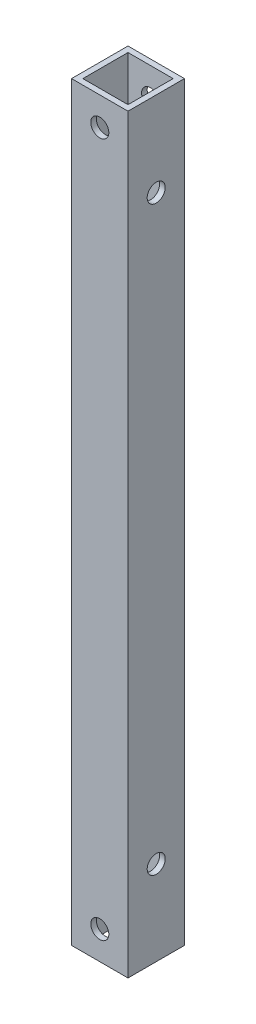
ISO-10303-21;
HEADER;
FILE_DESCRIPTION(('STEP AP214'),'2;1');
FILE_NAME('part.step','',(''),(''),'','','');
FILE_SCHEMA(('AUTOMOTIVE_DESIGN { 1 0 10303 214 1 1 1 1 }'));
ENDSEC;
DATA;
#1=APPLICATION_CONTEXT('core data for automotive mechanical design processes');
#2=APPLICATION_PROTOCOL_DEFINITION('international standard','automotive_design',2000,#1);
#3=PRODUCT_CONTEXT('',#1,'mechanical');
#4=PRODUCT('Part','Part','',(#3));
#5=PRODUCT_RELATED_PRODUCT_CATEGORY('part','',(#4));
#6=PRODUCT_DEFINITION_FORMATION('','',#4);
#7=PRODUCT_DEFINITION_CONTEXT('part definition',#1,'design');
#8=PRODUCT_DEFINITION('design','',#6,#7);
#9=PRODUCT_DEFINITION_SHAPE('','',#8);
#10=(LENGTH_UNIT() NAMED_UNIT(*) SI_UNIT(.MILLI.,.METRE.));
#11=(NAMED_UNIT(*) PLANE_ANGLE_UNIT() SI_UNIT($,.RADIAN.));
#12=(NAMED_UNIT(*) SI_UNIT($,.STERADIAN.) SOLID_ANGLE_UNIT());
#13=UNCERTAINTY_MEASURE_WITH_UNIT(LENGTH_MEASURE(1.E-05),#10,'distance_accuracy_value','');
#14=(GEOMETRIC_REPRESENTATION_CONTEXT(3) GLOBAL_UNCERTAINTY_ASSIGNED_CONTEXT((#13)) GLOBAL_UNIT_ASSIGNED_CONTEXT((#10,
#11,#12)) REPRESENTATION_CONTEXT('',''));
#15=CARTESIAN_POINT('',(0.,0.,0.));
#16=DIRECTION('',(0.,0.,1.));
#17=DIRECTION('',(1.,0.,0.));
#18=AXIS2_PLACEMENT_3D('',#15,#16,#17);
#19=CARTESIAN_POINT('',(22.4998286122686,-128.,10.));
#20=DIRECTION('',(0.,0.,-1.));
#21=DIRECTION('',(-1.,0.,0.));
#22=AXIS2_PLACEMENT_3D('',#19,#20,#21);
#23=CYLINDRICAL_SURFACE('',#22,1.59999999999999);
#24=CARTESIAN_POINT('',(22.4998286122686,-128.,9.));
#25=DIRECTION('',(0.,0.,1.));
#26=DIRECTION('',(1.,0.,0.));
#27=AXIS2_PLACEMENT_3D('',#24,#25,#26);
#28=CIRCLE('',#27,1.59999999999999);
#29=CARTESIAN_POINT('',(24.0998286122686,-128.,9.));
#30=VERTEX_POINT('',#29);
#31=EDGE_CURVE('E146',#30,#30,#28,.T.);
#32=ORIENTED_EDGE('',*,*,#31,.F.);
#33=EDGE_LOOP('',(#32));
#34=FACE_BOUND('',#33,.T.);
#35=CARTESIAN_POINT('',(22.4998286122686,-128.,10.));
#36=DIRECTION('',(0.,0.,1.));
#37=DIRECTION('',(1.,0.,0.));
#38=AXIS2_PLACEMENT_3D('',#35,#36,#37);
#39=CIRCLE('',#38,1.59999999999999);
#40=CARTESIAN_POINT('',(24.0998286122686,-128.,10.));
#41=VERTEX_POINT('',#40);
#42=EDGE_CURVE('E171',#41,#41,#39,.T.);
#43=ORIENTED_EDGE('',*,*,#42,.T.);
#44=EDGE_LOOP('',(#43));
#45=FACE_BOUND('',#44,.T.);
#46=ADVANCED_FACE('F33',(#34,#45),#23,.F.);
#47=CARTESIAN_POINT('',(22.4998286122686,-5.,10.));
#48=DIRECTION('',(0.,0.,-1.));
#49=DIRECTION('',(-1.,0.,0.));
#50=AXIS2_PLACEMENT_3D('',#47,#48,#49);
#51=CYLINDRICAL_SURFACE('',#50,1.6);
#52=CARTESIAN_POINT('',(22.4998286122686,-5.,9.));
#53=DIRECTION('',(0.,0.,1.));
#54=DIRECTION('',(1.,0.,0.));
#55=AXIS2_PLACEMENT_3D('',#52,#53,#54);
#56=CIRCLE('',#55,1.6);
#57=CARTESIAN_POINT('',(24.0998286122686,-5.,9.));
#58=VERTEX_POINT('',#57);
#59=EDGE_CURVE('E37',#58,#58,#56,.T.);
#60=ORIENTED_EDGE('',*,*,#59,.F.);
#61=EDGE_LOOP('',(#60));
#62=FACE_BOUND('',#61,.T.);
#63=CARTESIAN_POINT('',(22.4998286122686,-5.,10.));
#64=DIRECTION('',(0.,0.,1.));
#65=DIRECTION('',(1.,0.,0.));
#66=AXIS2_PLACEMENT_3D('',#63,#64,#65);
#67=CIRCLE('',#66,1.6);
#68=CARTESIAN_POINT('',(24.0998286122686,-5.,10.));
#69=VERTEX_POINT('',#68);
#70=EDGE_CURVE('E165',#69,#69,#67,.T.);
#71=ORIENTED_EDGE('',*,*,#70,.T.);
#72=EDGE_LOOP('',(#71));
#73=FACE_BOUND('',#72,.T.);
#74=ADVANCED_FACE('F215',(#62,#73),#51,.F.);
#75=CARTESIAN_POINT('',(12.4998286122686,-15.,5.00000000000002));
#76=DIRECTION('',(1.,0.,0.));
#77=DIRECTION('',(0.,1.,0.));
#78=AXIS2_PLACEMENT_3D('',#75,#76,#77);
#79=CYLINDRICAL_SURFACE('',#78,1.6);
#80=CARTESIAN_POINT('',(18.4998286122686,-15.,5.00000000000002));
#81=DIRECTION('',(-1.,0.,0.));
#82=DIRECTION('',(0.,0.,1.));
#83=AXIS2_PLACEMENT_3D('',#80,#81,#82);
#84=CIRCLE('',#83,1.6);
#85=CARTESIAN_POINT('',(18.4998286122686,-15.,6.60000000000001));
#86=VERTEX_POINT('',#85);
#87=EDGE_CURVE('E134',#86,#86,#84,.F.);
#88=ORIENTED_EDGE('',*,*,#87,.T.);
#89=EDGE_LOOP('',(#88));
#90=FACE_BOUND('',#89,.T.);
#91=CARTESIAN_POINT('',(17.4998286122686,-15.,5.00000000000002));
#92=DIRECTION('',(1.,0.,0.));
#93=DIRECTION('',(0.,1.,0.));
#94=AXIS2_PLACEMENT_3D('',#91,#92,#93);
#95=CIRCLE('',#94,1.6);
#96=CARTESIAN_POINT('',(17.4998286122686,-13.4,5.00000000000002));
#97=VERTEX_POINT('',#96);
#98=EDGE_CURVE('E156',#97,#97,#95,.T.);
#99=ORIENTED_EDGE('',*,*,#98,.F.);
#100=EDGE_LOOP('',(#99));
#101=FACE_BOUND('',#100,.T.);
#102=ADVANCED_FACE('F241',(#90,#101),#79,.F.);
#103=CARTESIAN_POINT('',(12.4998286122686,-118.,5.));
#104=DIRECTION('',(1.,0.,0.));
#105=DIRECTION('',(0.,1.,0.));
#106=AXIS2_PLACEMENT_3D('',#103,#104,#105);
#107=CYLINDRICAL_SURFACE('',#106,1.6);
#108=CARTESIAN_POINT('',(18.4998286122686,-118.,5.));
#109=DIRECTION('',(-1.,0.,0.));
#110=DIRECTION('',(0.,0.,1.));
#111=AXIS2_PLACEMENT_3D('',#108,#109,#110);
#112=CIRCLE('',#111,1.6);
#113=CARTESIAN_POINT('',(18.4998286122686,-118.,6.6));
#114=VERTEX_POINT('',#113);
#115=EDGE_CURVE('E133',#114,#114,#112,.F.);
#116=ORIENTED_EDGE('',*,*,#115,.T.);
#117=EDGE_LOOP('',(#116));
#118=FACE_BOUND('',#117,.T.);
#119=CARTESIAN_POINT('',(17.4998286122686,-118.,5.));
#120=DIRECTION('',(1.,0.,0.));
#121=DIRECTION('',(0.,1.,0.));
#122=AXIS2_PLACEMENT_3D('',#119,#120,#121);
#123=CIRCLE('',#122,1.6);
#124=CARTESIAN_POINT('',(17.4998286122686,-116.4,5.));
#125=VERTEX_POINT('',#124);
#126=EDGE_CURVE('E161',#125,#125,#123,.T.);
#127=ORIENTED_EDGE('',*,*,#126,.F.);
#128=EDGE_LOOP('',(#127));
#129=FACE_BOUND('',#128,.T.);
#130=ADVANCED_FACE('F228',(#118,#129),#107,.F.);
#131=CARTESIAN_POINT('',(0.,0.,10.));
#132=DIRECTION('',(0.,0.,1.));
#133=DIRECTION('',(1.,0.,0.));
#134=AXIS2_PLACEMENT_3D('',#131,#132,#133);
#135=PLANE('',#134);
#136=ORIENTED_EDGE('',*,*,#42,.F.);
#137=EDGE_LOOP('',(#136));
#138=FACE_BOUND('',#137,.T.);
#139=DIRECTION('',(0.,-1.,0.));
#140=VECTOR('',#139,1.);
#141=CARTESIAN_POINT('',(17.4998286122686,0.,10.));
#142=LINE('',#141,#140);
#143=CARTESIAN_POINT('',(17.4998286122686,0.,10.));
#144=VERTEX_POINT('',#143);
#145=CARTESIAN_POINT('',(17.4998286122686,-133.,10.));
#146=VERTEX_POINT('',#145);
#147=EDGE_CURVE('E177',#144,#146,#142,.T.);
#148=ORIENTED_EDGE('',*,*,#147,.T.);
#149=DIRECTION('',(1.,0.,0.));
#150=VECTOR('',#149,1.);
#151=CARTESIAN_POINT('',(17.4998286122686,-133.,10.));
#152=LINE('',#151,#150);
#153=CARTESIAN_POINT('',(27.4998286122686,-133.,10.));
#154=VERTEX_POINT('',#153);
#155=EDGE_CURVE('E180',#146,#154,#152,.T.);
#156=ORIENTED_EDGE('',*,*,#155,.T.);
#157=DIRECTION('',(0.,1.,0.));
#158=VECTOR('',#157,1.);
#159=CARTESIAN_POINT('',(27.4998286122686,0.,10.));
#160=LINE('',#159,#158);
#161=CARTESIAN_POINT('',(27.4998286122686,0.,10.));
#162=VERTEX_POINT('',#161);
#163=EDGE_CURVE('E183',#154,#162,#160,.T.);
#164=ORIENTED_EDGE('',*,*,#163,.T.);
#165=DIRECTION('',(-1.,0.,0.));
#166=VECTOR('',#165,1.);
#167=CARTESIAN_POINT('',(17.4998286122686,0.,10.));
#168=LINE('',#167,#166);
#169=EDGE_CURVE('E185',#162,#144,#168,.T.);
#170=ORIENTED_EDGE('',*,*,#169,.T.);
#171=EDGE_LOOP('',(#148,#156,#164,#170));
#172=FACE_BOUND('',#171,.T.);
#173=ORIENTED_EDGE('',*,*,#70,.F.);
#174=EDGE_LOOP('',(#173));
#175=FACE_BOUND('',#174,.T.);
#176=ADVANCED_FACE('F220',(#138,#172,#175),#135,.T.);
#177=CARTESIAN_POINT('',(0.,0.,0.));
#178=DIRECTION('',(0.,0.,1.));
#179=DIRECTION('',(1.,0.,0.));
#180=AXIS2_PLACEMENT_3D('',#177,#178,#179);
#181=PLANE('',#180);
#182=DIRECTION('',(0.,-1.,0.));
#183=VECTOR('',#182,1.);
#184=CARTESIAN_POINT('',(17.4998286122686,0.,0.));
#185=LINE('',#184,#183);
#186=CARTESIAN_POINT('',(17.4998286122686,0.,0.));
#187=VERTEX_POINT('',#186);
#188=CARTESIAN_POINT('',(17.4998286122686,-133.,0.));
#189=VERTEX_POINT('',#188);
#190=EDGE_CURVE('E174',#187,#189,#185,.T.);
#191=ORIENTED_EDGE('',*,*,#190,.F.);
#192=DIRECTION('',(-1.,0.,0.));
#193=VECTOR('',#192,1.);
#194=CARTESIAN_POINT('',(17.4998286122686,0.,0.));
#195=LINE('',#194,#193);
#196=CARTESIAN_POINT('',(27.4998286122686,0.,0.));
#197=VERTEX_POINT('',#196);
#198=EDGE_CURVE('E181',#197,#187,#195,.T.);
#199=ORIENTED_EDGE('',*,*,#198,.F.);
#200=DIRECTION('',(0.,1.,0.));
#201=VECTOR('',#200,1.);
#202=CARTESIAN_POINT('',(27.4998286122686,0.,0.));
#203=LINE('',#202,#201);
#204=CARTESIAN_POINT('',(27.4998286122686,-133.,0.));
#205=VERTEX_POINT('',#204);
#206=EDGE_CURVE('E192',#205,#197,#203,.T.);
#207=ORIENTED_EDGE('',*,*,#206,.F.);
#208=DIRECTION('',(1.,0.,0.));
#209=VECTOR('',#208,1.);
#210=CARTESIAN_POINT('',(17.4998286122686,-133.,0.));
#211=LINE('',#210,#209);
#212=EDGE_CURVE('E190',#189,#205,#211,.T.);
#213=ORIENTED_EDGE('',*,*,#212,.F.);
#214=EDGE_LOOP('',(#191,#199,#207,#213));
#215=FACE_BOUND('',#214,.T.);
#216=CARTESIAN_POINT('',(22.4998286122686,-128.,0.));
#217=DIRECTION('',(0.,0.,1.));
#218=DIRECTION('',(1.,0.,0.));
#219=AXIS2_PLACEMENT_3D('',#216,#217,#218);
#220=CIRCLE('',#219,1.59999999999999);
#221=CARTESIAN_POINT('',(24.0998286122686,-128.,0.));
#222=VERTEX_POINT('',#221);
#223=EDGE_CURVE('E168',#222,#222,#220,.T.);
#224=ORIENTED_EDGE('',*,*,#223,.T.);
#225=EDGE_LOOP('',(#224));
#226=FACE_BOUND('',#225,.T.);
#227=CARTESIAN_POINT('',(22.4998286122686,-5.,0.));
#228=DIRECTION('',(0.,0.,1.));
#229=DIRECTION('',(1.,0.,0.));
#230=AXIS2_PLACEMENT_3D('',#227,#228,#229);
#231=CIRCLE('',#230,1.6);
#232=CARTESIAN_POINT('',(24.0998286122686,-5.,0.));
#233=VERTEX_POINT('',#232);
#234=EDGE_CURVE('E164',#233,#233,#231,.T.);
#235=ORIENTED_EDGE('',*,*,#234,.T.);
#236=EDGE_LOOP('',(#235));
#237=FACE_BOUND('',#236,.T.);
#238=ADVANCED_FACE('F218',(#215,#226,#237),#181,.F.);
#239=CARTESIAN_POINT('',(17.4998286122686,0.,10.));
#240=DIRECTION('',(1.,0.,0.));
#241=DIRECTION('',(0.,1.,0.));
#242=AXIS2_PLACEMENT_3D('',#239,#240,#241);
#243=PLANE('',#242);
#244=ORIENTED_EDGE('',*,*,#126,.T.);
#245=EDGE_LOOP('',(#244));
#246=FACE_BOUND('',#245,.T.);
#247=ORIENTED_EDGE('',*,*,#98,.T.);
#248=EDGE_LOOP('',(#247));
#249=FACE_BOUND('',#248,.T.);
#250=ORIENTED_EDGE('',*,*,#190,.T.);
#251=DIRECTION('',(0.,0.,-1.));
#252=VECTOR('',#251,1.);
#253=CARTESIAN_POINT('',(17.4998286122686,-133.,10.));
#254=LINE('',#253,#252);
#255=EDGE_CURVE('E11',#146,#189,#254,.T.);
#256=ORIENTED_EDGE('',*,*,#255,.F.);
#257=ORIENTED_EDGE('',*,*,#147,.F.);
#258=DIRECTION('',(0.,0.,-1.));
#259=VECTOR('',#258,1.);
#260=CARTESIAN_POINT('',(17.4998286122686,0.,10.));
#261=LINE('',#260,#259);
#262=EDGE_CURVE('E187',#144,#187,#261,.T.);
#263=ORIENTED_EDGE('',*,*,#262,.T.);
#264=EDGE_LOOP('',(#250,#256,#257,#263));
#265=FACE_BOUND('',#264,.T.);
#266=ADVANCED_FACE('F35',(#246,#249,#265),#243,.F.);
#267=CARTESIAN_POINT('',(17.4998286122686,-133.,10.));
#268=DIRECTION('',(0.,1.,0.));
#269=DIRECTION('',(0.,0.,1.));
#270=AXIS2_PLACEMENT_3D('',#267,#268,#269);
#271=PLANE('',#270);
#272=DIRECTION('',(1.,0.,0.));
#273=VECTOR('',#272,1.);
#274=CARTESIAN_POINT('',(18.4998286122686,-133.,1.));
#275=LINE('',#274,#273);
#276=CARTESIAN_POINT('',(18.4998286122686,-133.,0.999999999999999));
#277=VERTEX_POINT('',#276);
#278=CARTESIAN_POINT('',(26.4998286122686,-133.,1.));
#279=VERTEX_POINT('',#278);
#280=EDGE_CURVE('E112',#277,#279,#275,.T.);
#281=ORIENTED_EDGE('',*,*,#280,.F.);
#282=DIRECTION('',(0.,0.,-1.));
#283=VECTOR('',#282,1.);
#284=CARTESIAN_POINT('',(18.4998286122686,-133.,9.));
#285=LINE('',#284,#283);
#286=CARTESIAN_POINT('',(18.4998286122686,-133.,9.));
#287=VERTEX_POINT('',#286);
#288=EDGE_CURVE('E50',#287,#277,#285,.T.);
#289=ORIENTED_EDGE('',*,*,#288,.F.);
#290=DIRECTION('',(-1.,0.,0.));
#291=VECTOR('',#290,1.);
#292=CARTESIAN_POINT('',(26.4998286122686,-133.,9.));
#293=LINE('',#292,#291);
#294=CARTESIAN_POINT('',(26.4998286122686,-133.,9.));
#295=VERTEX_POINT('',#294);
#296=EDGE_CURVE('E119',#295,#287,#293,.T.);
#297=ORIENTED_EDGE('',*,*,#296,.F.);
#298=DIRECTION('',(0.,0.,1.));
#299=VECTOR('',#298,1.);
#300=CARTESIAN_POINT('',(26.4998286122686,-133.,1.));
#301=LINE('',#300,#299);
#302=EDGE_CURVE('E103',#279,#295,#301,.T.);
#303=ORIENTED_EDGE('',*,*,#302,.F.);
#304=EDGE_LOOP('',(#281,#289,#297,#303));
#305=FACE_BOUND('',#304,.T.);
#306=ORIENTED_EDGE('',*,*,#212,.T.);
#307=DIRECTION('',(0.,0.,-1.));
#308=VECTOR('',#307,1.);
#309=CARTESIAN_POINT('',(27.4998286122686,-133.,10.));
#310=LINE('',#309,#308);
#311=EDGE_CURVE('E42',#154,#205,#310,.T.);
#312=ORIENTED_EDGE('',*,*,#311,.F.);
#313=ORIENTED_EDGE('',*,*,#155,.F.);
#314=ORIENTED_EDGE('',*,*,#255,.T.);
#315=EDGE_LOOP('',(#306,#312,#313,#314));
#316=FACE_BOUND('',#315,.T.);
#317=ADVANCED_FACE('F116',(#305,#316),#271,.F.);
#318=CARTESIAN_POINT('',(27.4998286122686,0.,10.));
#319=DIRECTION('',(-1.,0.,0.));
#320=DIRECTION('',(0.,-1.,0.));
#321=AXIS2_PLACEMENT_3D('',#318,#319,#320);
#322=PLANE('',#321);
#323=CARTESIAN_POINT('',(27.4998286122686,-118.,5.));
#324=DIRECTION('',(1.,0.,0.));
#325=DIRECTION('',(0.,1.,0.));
#326=AXIS2_PLACEMENT_3D('',#323,#324,#325);
#327=CIRCLE('',#326,1.6);
#328=CARTESIAN_POINT('',(27.4998286122686,-116.4,5.));
#329=VERTEX_POINT('',#328);
#330=EDGE_CURVE('E153',#329,#329,#327,.T.);
#331=ORIENTED_EDGE('',*,*,#330,.F.);
#332=EDGE_LOOP('',(#331));
#333=FACE_BOUND('',#332,.T.);
#334=CARTESIAN_POINT('',(27.4998286122686,-15.,5.00000000000002));
#335=DIRECTION('',(1.,0.,0.));
#336=DIRECTION('',(0.,1.,0.));
#337=AXIS2_PLACEMENT_3D('',#334,#335,#336);
#338=CIRCLE('',#337,1.6);
#339=CARTESIAN_POINT('',(27.4998286122686,-13.4,5.00000000000002));
#340=VERTEX_POINT('',#339);
#341=EDGE_CURVE('E152',#340,#340,#338,.T.);
#342=ORIENTED_EDGE('',*,*,#341,.F.);
#343=EDGE_LOOP('',(#342));
#344=FACE_BOUND('',#343,.T.);
#345=ORIENTED_EDGE('',*,*,#206,.T.);
#346=DIRECTION('',(0.,0.,-1.));
#347=VECTOR('',#346,1.);
#348=CARTESIAN_POINT('',(27.4998286122686,0.,10.));
#349=LINE('',#348,#347);
#350=EDGE_CURVE('E197',#162,#197,#349,.T.);
#351=ORIENTED_EDGE('',*,*,#350,.F.);
#352=ORIENTED_EDGE('',*,*,#163,.F.);
#353=ORIENTED_EDGE('',*,*,#311,.T.);
#354=EDGE_LOOP('',(#345,#351,#352,#353));
#355=FACE_BOUND('',#354,.T.);
#356=ADVANCED_FACE('F251',(#333,#344,#355),#322,.F.);
#357=CARTESIAN_POINT('',(17.4998286122686,0.,10.));
#358=DIRECTION('',(0.,-1.,0.));
#359=DIRECTION('',(1.,0.,0.));
#360=AXIS2_PLACEMENT_3D('',#357,#358,#359);
#361=PLANE('',#360);
#362=DIRECTION('',(-1.,0.,0.));
#363=VECTOR('',#362,1.);
#364=CARTESIAN_POINT('',(17.4998286122686,0.,9.));
#365=LINE('',#364,#363);
#366=CARTESIAN_POINT('',(26.4998286122686,0.,9.));
#367=VERTEX_POINT('',#366);
#368=CARTESIAN_POINT('',(18.4998286122686,0.,9.));
#369=VERTEX_POINT('',#368);
#370=EDGE_CURVE('E149',#367,#369,#365,.T.);
#371=ORIENTED_EDGE('',*,*,#370,.T.);
#372=DIRECTION('',(0.,0.,-1.));
#373=VECTOR('',#372,1.);
#374=CARTESIAN_POINT('',(18.4998286122686,0.,10.));
#375=LINE('',#374,#373);
#376=CARTESIAN_POINT('',(18.4998286122686,0.,1.));
#377=VERTEX_POINT('',#376);
#378=EDGE_CURVE('E137',#369,#377,#375,.T.);
#379=ORIENTED_EDGE('',*,*,#378,.T.);
#380=DIRECTION('',(1.,0.,0.));
#381=VECTOR('',#380,1.);
#382=CARTESIAN_POINT('',(17.4998286122686,0.,0.999999999999999));
#383=LINE('',#382,#381);
#384=CARTESIAN_POINT('',(26.4998286122686,0.,0.999999999999999));
#385=VERTEX_POINT('',#384);
#386=EDGE_CURVE('E144',#377,#385,#383,.T.);
#387=ORIENTED_EDGE('',*,*,#386,.T.);
#388=DIRECTION('',(0.,0.,1.));
#389=VECTOR('',#388,1.);
#390=CARTESIAN_POINT('',(26.4998286122686,0.,10.));
#391=LINE('',#390,#389);
#392=EDGE_CURVE('E106',#385,#367,#391,.T.);
#393=ORIENTED_EDGE('',*,*,#392,.T.);
#394=EDGE_LOOP('',(#371,#379,#387,#393));
#395=FACE_BOUND('',#394,.T.);
#396=ORIENTED_EDGE('',*,*,#198,.T.);
#397=ORIENTED_EDGE('',*,*,#262,.F.);
#398=ORIENTED_EDGE('',*,*,#169,.F.);
#399=ORIENTED_EDGE('',*,*,#350,.T.);
#400=EDGE_LOOP('',(#396,#397,#398,#399));
#401=FACE_BOUND('',#400,.T.);
#402=ADVANCED_FACE('F246',(#395,#401),#361,.F.);
#403=CARTESIAN_POINT('',(22.4998286122686,-128.,0.999999999999999));
#404=DIRECTION('',(0.,0.,-1.));
#405=DIRECTION('',(-1.,0.,0.));
#406=AXIS2_PLACEMENT_3D('',#403,#404,#405);
#407=CIRCLE('',#406,1.59999999999999);
#408=CARTESIAN_POINT('',(20.8998286122686,-128.,0.999999999999999));
#409=VERTEX_POINT('',#408);
#410=EDGE_CURVE('E141',#409,#409,#407,.T.);
#411=ORIENTED_EDGE('',*,*,#410,.F.);
#412=EDGE_LOOP('',(#411));
#413=FACE_BOUND('',#412,.T.);
#414=ORIENTED_EDGE('',*,*,#223,.F.);
#415=EDGE_LOOP('',(#414));
#416=FACE_BOUND('',#415,.T.);
#417=ADVANCED_FACE('F213',(#413,#416),#23,.F.);
#418=CARTESIAN_POINT('',(22.4998286122686,-5.,0.999999999999999));
#419=DIRECTION('',(0.,0.,-1.));
#420=DIRECTION('',(-1.,0.,0.));
#421=AXIS2_PLACEMENT_3D('',#418,#419,#420);
#422=CIRCLE('',#421,1.6);
#423=CARTESIAN_POINT('',(20.8998286122686,-5.,0.999999999999999));
#424=VERTEX_POINT('',#423);
#425=EDGE_CURVE('E140',#424,#424,#422,.T.);
#426=ORIENTED_EDGE('',*,*,#425,.F.);
#427=EDGE_LOOP('',(#426));
#428=FACE_BOUND('',#427,.T.);
#429=ORIENTED_EDGE('',*,*,#234,.F.);
#430=EDGE_LOOP('',(#429));
#431=FACE_BOUND('',#430,.T.);
#432=ADVANCED_FACE('F209',(#428,#431),#51,.F.);
#433=CARTESIAN_POINT('',(26.4998286122686,-15.,5.00000000000002));
#434=DIRECTION('',(1.,0.,0.));
#435=DIRECTION('',(0.,0.,-1.));
#436=AXIS2_PLACEMENT_3D('',#433,#434,#435);
#437=CIRCLE('',#436,1.6);
#438=CARTESIAN_POINT('',(26.4998286122686,-15.,3.40000000000002));
#439=VERTEX_POINT('',#438);
#440=EDGE_CURVE('E129',#439,#439,#437,.F.);
#441=ORIENTED_EDGE('',*,*,#440,.T.);
#442=EDGE_LOOP('',(#441));
#443=FACE_BOUND('',#442,.T.);
#444=ORIENTED_EDGE('',*,*,#341,.T.);
#445=EDGE_LOOP('',(#444));
#446=FACE_BOUND('',#445,.T.);
#447=ADVANCED_FACE('F212',(#443,#446),#79,.F.);
#448=CARTESIAN_POINT('',(26.4998286122686,-118.,5.));
#449=DIRECTION('',(1.,0.,0.));
#450=DIRECTION('',(0.,0.,-1.));
#451=AXIS2_PLACEMENT_3D('',#448,#449,#450);
#452=CIRCLE('',#451,1.6);
#453=CARTESIAN_POINT('',(26.4998286122686,-118.,3.4));
#454=VERTEX_POINT('',#453);
#455=EDGE_CURVE('E126',#454,#454,#452,.F.);
#456=ORIENTED_EDGE('',*,*,#455,.T.);
#457=EDGE_LOOP('',(#456));
#458=FACE_BOUND('',#457,.T.);
#459=ORIENTED_EDGE('',*,*,#330,.T.);
#460=EDGE_LOOP('',(#459));
#461=FACE_BOUND('',#460,.T.);
#462=ADVANCED_FACE('F267',(#458,#461),#107,.F.);
#463=CARTESIAN_POINT('',(26.4998286122686,867.,9.));
#464=DIRECTION('',(0.,0.,1.));
#465=DIRECTION('',(1.,0.,0.));
#466=AXIS2_PLACEMENT_3D('',#463,#464,#465);
#467=PLANE('',#466);
#468=ORIENTED_EDGE('',*,*,#31,.T.);
#469=EDGE_LOOP('',(#468));
#470=FACE_BOUND('',#469,.T.);
#471=ORIENTED_EDGE('',*,*,#59,.T.);
#472=EDGE_LOOP('',(#471));
#473=FACE_BOUND('',#472,.T.);
#474=DIRECTION('',(0.,-1.,0.));
#475=VECTOR('',#474,1.);
#476=CARTESIAN_POINT('',(26.4998286122686,867.,9.));
#477=LINE('',#476,#475);
#478=EDGE_CURVE('E108',#367,#295,#477,.T.);
#479=ORIENTED_EDGE('',*,*,#478,.T.);
#480=ORIENTED_EDGE('',*,*,#296,.T.);
#481=DIRECTION('',(0.,-1.,0.));
#482=VECTOR('',#481,1.);
#483=CARTESIAN_POINT('',(18.4998286122686,867.,9.));
#484=LINE('',#483,#482);
#485=EDGE_CURVE('E124',#369,#287,#484,.T.);
#486=ORIENTED_EDGE('',*,*,#485,.F.);
#487=ORIENTED_EDGE('',*,*,#370,.F.);
#488=EDGE_LOOP('',(#479,#480,#486,#487));
#489=FACE_BOUND('',#488,.T.);
#490=ADVANCED_FACE('F259',(#470,#473,#489),#467,.F.);
#491=CARTESIAN_POINT('',(18.4998286122686,867.,1.));
#492=DIRECTION('',(0.,0.,-1.));
#493=DIRECTION('',(-1.,0.,0.));
#494=AXIS2_PLACEMENT_3D('',#491,#492,#493);
#495=PLANE('',#494);
#496=ORIENTED_EDGE('',*,*,#410,.T.);
#497=EDGE_LOOP('',(#496));
#498=FACE_BOUND('',#497,.T.);
#499=ORIENTED_EDGE('',*,*,#425,.T.);
#500=EDGE_LOOP('',(#499));
#501=FACE_BOUND('',#500,.T.);
#502=DIRECTION('',(0.,-1.,0.));
#503=VECTOR('',#502,1.);
#504=CARTESIAN_POINT('',(18.4998286122686,867.,1.));
#505=LINE('',#504,#503);
#506=EDGE_CURVE('E109',#377,#277,#505,.T.);
#507=ORIENTED_EDGE('',*,*,#506,.T.);
#508=ORIENTED_EDGE('',*,*,#280,.T.);
#509=DIRECTION('',(0.,-1.,0.));
#510=VECTOR('',#509,1.);
#511=CARTESIAN_POINT('',(26.4998286122686,867.,1.));
#512=LINE('',#511,#510);
#513=EDGE_CURVE('E58',#385,#279,#512,.T.);
#514=ORIENTED_EDGE('',*,*,#513,.F.);
#515=ORIENTED_EDGE('',*,*,#386,.F.);
#516=EDGE_LOOP('',(#507,#508,#514,#515));
#517=FACE_BOUND('',#516,.T.);
#518=ADVANCED_FACE('F113',(#498,#501,#517),#495,.F.);
#519=CARTESIAN_POINT('',(18.4998286122686,867.,9.));
#520=DIRECTION('',(-1.,0.,0.));
#521=DIRECTION('',(0.,0.,1.));
#522=AXIS2_PLACEMENT_3D('',#519,#520,#521);
#523=PLANE('',#522);
#524=ORIENTED_EDGE('',*,*,#115,.F.);
#525=EDGE_LOOP('',(#524));
#526=FACE_BOUND('',#525,.T.);
#527=ORIENTED_EDGE('',*,*,#87,.F.);
#528=EDGE_LOOP('',(#527));
#529=FACE_BOUND('',#528,.T.);
#530=ORIENTED_EDGE('',*,*,#485,.T.);
#531=ORIENTED_EDGE('',*,*,#288,.T.);
#532=ORIENTED_EDGE('',*,*,#506,.F.);
#533=ORIENTED_EDGE('',*,*,#378,.F.);
#534=EDGE_LOOP('',(#530,#531,#532,#533));
#535=FACE_BOUND('',#534,.T.);
#536=ADVANCED_FACE('F258',(#526,#529,#535),#523,.F.);
#537=CARTESIAN_POINT('',(26.4998286122686,867.,1.));
#538=DIRECTION('',(1.,0.,0.));
#539=DIRECTION('',(0.,0.,-1.));
#540=AXIS2_PLACEMENT_3D('',#537,#538,#539);
#541=PLANE('',#540);
#542=ORIENTED_EDGE('',*,*,#455,.F.);
#543=EDGE_LOOP('',(#542));
#544=FACE_BOUND('',#543,.T.);
#545=ORIENTED_EDGE('',*,*,#440,.F.);
#546=EDGE_LOOP('',(#545));
#547=FACE_BOUND('',#546,.T.);
#548=ORIENTED_EDGE('',*,*,#513,.T.);
#549=ORIENTED_EDGE('',*,*,#302,.T.);
#550=ORIENTED_EDGE('',*,*,#478,.F.);
#551=ORIENTED_EDGE('',*,*,#392,.F.);
#552=EDGE_LOOP('',(#548,#549,#550,#551));
#553=FACE_BOUND('',#552,.T.);
#554=ADVANCED_FACE('F100',(#544,#547,#553),#541,.F.);
#555=CLOSED_SHELL('',(#46,#74,#102,#130,#176,#238,#266,#317,#356,#402,#417,#432,#447,#462,#490,
#518,#536,#554));
#556=MANIFOLD_SOLID_BREP('B2',#555);
#557=ADVANCED_BREP_SHAPE_REPRESENTATION('',(#18,#556),#14);
#558=SHAPE_DEFINITION_REPRESENTATION(#9,#557);
ENDSEC;
END-ISO-10303-21;
